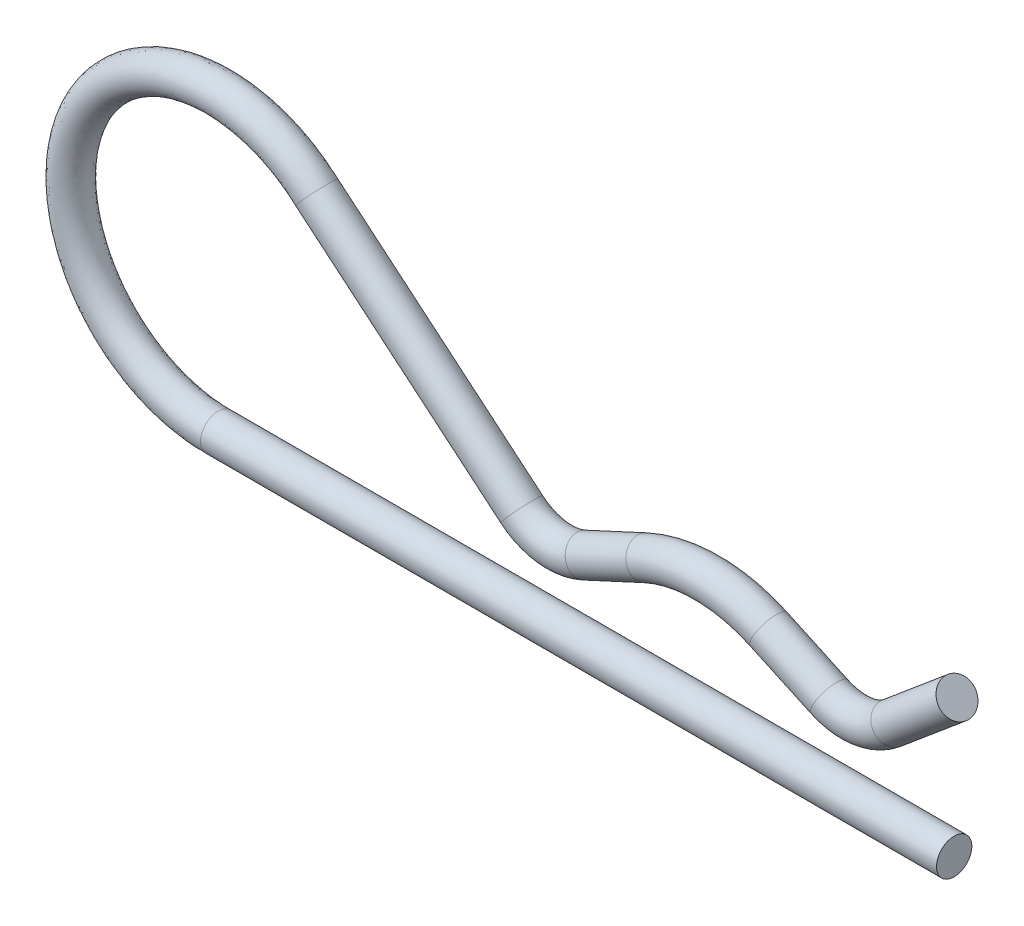
ISO-10303-21;
HEADER;
FILE_DESCRIPTION(('STEP AP214'),'2;1');
FILE_NAME('part.step','',(''),(''),'','','');
FILE_SCHEMA(('AUTOMOTIVE_DESIGN { 1 0 10303 214 1 1 1 1 }'));
ENDSEC;
DATA;
#1=APPLICATION_CONTEXT('core data for automotive mechanical design processes');
#2=APPLICATION_PROTOCOL_DEFINITION('international standard','automotive_design',2000,#1);
#3=PRODUCT_CONTEXT('',#1,'mechanical');
#4=PRODUCT('Part','Part','',(#3));
#5=PRODUCT_RELATED_PRODUCT_CATEGORY('part','',(#4));
#6=PRODUCT_DEFINITION_FORMATION('','',#4);
#7=PRODUCT_DEFINITION_CONTEXT('part definition',#1,'design');
#8=PRODUCT_DEFINITION('design','',#6,#7);
#9=PRODUCT_DEFINITION_SHAPE('','',#8);
#10=(LENGTH_UNIT() NAMED_UNIT(*) SI_UNIT(.MILLI.,.METRE.));
#11=(NAMED_UNIT(*) PLANE_ANGLE_UNIT() SI_UNIT($,.RADIAN.));
#12=(NAMED_UNIT(*) SI_UNIT($,.STERADIAN.) SOLID_ANGLE_UNIT());
#13=UNCERTAINTY_MEASURE_WITH_UNIT(LENGTH_MEASURE(1.E-05),#10,'distance_accuracy_value','');
#14=(GEOMETRIC_REPRESENTATION_CONTEXT(3) GLOBAL_UNCERTAINTY_ASSIGNED_CONTEXT((#13)) GLOBAL_UNIT_ASSIGNED_CONTEXT((#10,
#11,#12)) REPRESENTATION_CONTEXT('',''));
#15=CARTESIAN_POINT('',(0.,0.,0.));
#16=DIRECTION('',(0.,0.,1.));
#17=DIRECTION('',(1.,0.,0.));
#18=AXIS2_PLACEMENT_3D('',#15,#16,#17);
#19=CARTESIAN_POINT('',(0.244756199941598,11.9963702221383,0.));
#20=DIRECTION('',(-0.766044443118982,-0.642787609686535,0.));
#21=DIRECTION('',(0.642787609686535,-0.766044443118982,0.));
#22=AXIS2_PLACEMENT_3D('',#19,#20,#21);
#23=PLANE('',#22);
#24=CARTESIAN_POINT('',(0.244756199941598,11.9963702221383,0.));
#25=DIRECTION('',(-0.766044443118982,-0.642787609686535,0.));
#26=DIRECTION('',(0.642787609686535,-0.766044443118982,0.));
#27=AXIS2_PLACEMENT_3D('',#24,#25,#26);
#28=CIRCLE('',#27,1.524);
#29=CARTESIAN_POINT('',(1.22436451710388,10.828918490825,0.));
#30=VERTEX_POINT('',#29);
#31=EDGE_CURVE('E54',#30,#30,#28,.T.);
#32=ORIENTED_EDGE('',*,*,#31,.F.);
#33=EDGE_LOOP('',(#32));
#34=FACE_BOUND('',#33,.T.);
#35=ADVANCED_FACE('F51',(#34),#23,.F.);
#36=CARTESIAN_POINT('',(0.,0.,0.));
#37=DIRECTION('',(1.,0.,0.));
#38=DIRECTION('',(0.,1.,0.));
#39=AXIS2_PLACEMENT_3D('',#36,#37,#38);
#40=PLANE('',#39);
#41=CARTESIAN_POINT('',(0.,0.,0.));
#42=DIRECTION('',(1.,0.,0.));
#43=DIRECTION('',(0.,1.,0.));
#44=AXIS2_PLACEMENT_3D('',#41,#42,#43);
#45=CIRCLE('',#44,1.524);
#46=CARTESIAN_POINT('',(0.,0.,1.524));
#47=VERTEX_POINT('',#46);
#48=EDGE_CURVE('E77',#47,#47,#45,.T.);
#49=ORIENTED_EDGE('',*,*,#48,.T.);
#50=EDGE_LOOP('',(#49));
#51=FACE_BOUND('',#50,.T.);
#52=ADVANCED_FACE('F151',(#51),#40,.T.);
#53=CARTESIAN_POINT('',(-34.036,11.176,0.));
#54=DIRECTION('',(0.,0.,1.));
#55=DIRECTION('',(1.,0.,0.));
#56=AXIS2_PLACEMENT_3D('',#53,#54,#55);
#57=TOROIDAL_SURFACE('',#56,5.08000000000001,1.524);
#58=CARTESIAN_POINT('',(-37.3013610572076,7.28449422895555,0.));
#59=DIRECTION('',(-0.766044443118981,0.642787609686536,0.));
#60=DIRECTION('',(-0.642787609686536,-0.766044443118981,0.));
#61=AXIS2_PLACEMENT_3D('',#58,#59,#60);
#62=CIRCLE('',#61,1.524);
#63=CARTESIAN_POINT('',(-38.2809693743699,6.11704249764223,0.));
#64=VERTEX_POINT('',#63);
#65=EDGE_CURVE('E143',#64,#64,#62,.T.);
#66=CARTESIAN_POINT('',(-31.9036795697341,6.56518558357955,0.));
#67=DIRECTION('',(-0.907640633153629,-0.41974811619408,0.));
#68=DIRECTION('',(0.41974811619408,-0.907640633153629,0.));
#69=AXIS2_PLACEMENT_3D('',#66,#67,#68);
#70=CIRCLE('',#69,1.524);
#71=CARTESIAN_POINT('',(-31.2639834406543,5.18194125865343,0.));
#72=VERTEX_POINT('',#71);
#73=EDGE_CURVE('E140',#72,#72,#70,.T.);
#74=CARTESIAN_POINT('',(-34.036,11.176,0.));
#75=DIRECTION('',(0.,0.,1.));
#76=DIRECTION('',(1.,0.,0.));
#77=AXIS2_PLACEMENT_3D('',#74,#75,#76);
#78=CIRCLE('',#77,6.60400000000001);
#79=EDGE_CURVE('',#64,#72,#78,.T.);
#80=ORIENTED_EDGE('',*,*,#65,.F.);
#81=ORIENTED_EDGE('',*,*,#73,.T.);
#82=ORIENTED_EDGE('',*,*,#79,.T.);
#83=ORIENTED_EDGE('',*,*,#79,.F.);
#84=EDGE_LOOP('',(#80,#82,#81,#83));
#85=FACE_BOUND('',#84,.T.);
#86=ADVANCED_FACE('F148',(#85),#57,.T.);
#87=CARTESIAN_POINT('',(-31.9036795697341,6.56518558357956,0.));
#88=DIRECTION('',(0.907640633153629,0.419748116194081,0.));
#89=DIRECTION('',(-0.419748116194081,0.907640633153629,0.));
#90=AXIS2_PLACEMENT_3D('',#87,#88,#89);
#91=CYLINDRICAL_SURFACE('',#90,1.524);
#92=CARTESIAN_POINT('',(-26.6668010756648,8.98703604105108,0.));
#93=DIRECTION('',(-0.90764063315363,-0.41974811619408,0.));
#94=DIRECTION('',(0.41974811619408,-0.90764063315363,0.));
#95=AXIS2_PLACEMENT_3D('',#92,#93,#94);
#96=CIRCLE('',#95,1.524);
#97=CARTESIAN_POINT('',(-27.3064972047446,10.3702803659772,0.));
#98=VERTEX_POINT('',#97);
#99=EDGE_CURVE('E136',#98,#98,#96,.T.);
#100=ORIENTED_EDGE('',*,*,#99,.T.);
#101=EDGE_LOOP('',(#100));
#102=FACE_BOUND('',#101,.T.);
#103=ORIENTED_EDGE('',*,*,#73,.F.);
#104=EDGE_LOOP('',(#103));
#105=FACE_BOUND('',#104,.T.);
#106=ADVANCED_FACE('F150',(#102,#105),#91,.T.);
#107=CARTESIAN_POINT('',(-21.336,-2.54,0.));
#108=DIRECTION('',(0.,0.,-1.));
#109=DIRECTION('',(-1.,0.,0.));
#110=AXIS2_PLACEMENT_3D('',#107,#108,#109);
#111=TOROIDAL_SURFACE('',#110,12.7,1.524);
#112=CARTESIAN_POINT('',(-16.0051989243352,8.98703604105109,0.));
#113=DIRECTION('',(-0.907640633153629,0.419748116194081,0.));
#114=DIRECTION('',(-0.419748116194081,-0.907640633153629,0.));
#115=AXIS2_PLACEMENT_3D('',#112,#113,#114);
#116=CIRCLE('',#115,1.524);
#117=CARTESIAN_POINT('',(-15.3655027952554,10.3702803659772,0.));
#118=VERTEX_POINT('',#117);
#119=EDGE_CURVE('E130',#118,#118,#116,.T.);
#120=CARTESIAN_POINT('',(-21.336,-2.54,0.));
#121=DIRECTION('',(0.,0.,-1.));
#122=DIRECTION('',(-1.,0.,0.));
#123=AXIS2_PLACEMENT_3D('',#120,#121,#122);
#124=CIRCLE('',#123,14.224);
#125=EDGE_CURVE('',#98,#118,#124,.T.);
#126=ORIENTED_EDGE('',*,*,#99,.F.);
#127=ORIENTED_EDGE('',*,*,#119,.T.);
#128=ORIENTED_EDGE('',*,*,#125,.T.);
#129=ORIENTED_EDGE('',*,*,#125,.F.);
#130=EDGE_LOOP('',(#126,#128,#127,#129));
#131=FACE_BOUND('',#130,.T.);
#132=ADVANCED_FACE('F157',(#131),#111,.T.);
#133=CARTESIAN_POINT('',(-16.0051989243352,8.98703604105109,0.));
#134=DIRECTION('',(0.907640633153629,-0.419748116194081,0.));
#135=DIRECTION('',(0.419748116194081,0.907640633153629,0.));
#136=AXIS2_PLACEMENT_3D('',#133,#134,#135);
#137=CYLINDRICAL_SURFACE('',#136,1.524);
#138=CARTESIAN_POINT('',(-10.7683204302659,6.56518558357956,0.));
#139=DIRECTION('',(-0.907640633153629,0.419748116194082,0.));
#140=DIRECTION('',(-0.419748116194082,-0.907640633153628,0.));
#141=AXIS2_PLACEMENT_3D('',#138,#139,#140);
#142=CIRCLE('',#141,1.524);
#143=CARTESIAN_POINT('',(-11.4080165593457,5.18194125865343,0.));
#144=VERTEX_POINT('',#143);
#145=EDGE_CURVE('E125',#144,#144,#142,.T.);
#146=ORIENTED_EDGE('',*,*,#145,.T.);
#147=EDGE_LOOP('',(#146));
#148=FACE_BOUND('',#147,.T.);
#149=ORIENTED_EDGE('',*,*,#119,.F.);
#150=EDGE_LOOP('',(#149));
#151=FACE_BOUND('',#150,.T.);
#152=ADVANCED_FACE('F163',(#148,#151),#137,.T.);
#153=CARTESIAN_POINT('',(-8.636,11.176,0.));
#154=DIRECTION('',(0.,0.,1.));
#155=DIRECTION('',(1.,0.,0.));
#156=AXIS2_PLACEMENT_3D('',#153,#154,#155);
#157=TOROIDAL_SURFACE('',#156,5.08,1.524);
#158=CARTESIAN_POINT('',(-5.37063894279241,7.28449422895557,0.));
#159=DIRECTION('',(-0.766044443118982,-0.642787609686535,0.));
#160=DIRECTION('',(0.642787609686535,-0.766044443118982,0.));
#161=AXIS2_PLACEMENT_3D('',#158,#159,#160);
#162=CIRCLE('',#161,1.524);
#163=CARTESIAN_POINT('',(-4.39103062563013,6.11704249764224,0.));
#164=VERTEX_POINT('',#163);
#165=EDGE_CURVE('E120',#164,#164,#162,.T.);
#166=CARTESIAN_POINT('',(-8.636,11.176,0.));
#167=DIRECTION('',(0.,0.,1.));
#168=DIRECTION('',(1.,0.,0.));
#169=AXIS2_PLACEMENT_3D('',#166,#167,#168);
#170=CIRCLE('',#169,6.604);
#171=EDGE_CURVE('',#144,#164,#170,.T.);
#172=ORIENTED_EDGE('',*,*,#145,.F.);
#173=ORIENTED_EDGE('',*,*,#165,.T.);
#174=ORIENTED_EDGE('',*,*,#171,.T.);
#175=ORIENTED_EDGE('',*,*,#171,.F.);
#176=EDGE_LOOP('',(#172,#174,#173,#175));
#177=FACE_BOUND('',#176,.T.);
#178=ADVANCED_FACE('F167',(#177),#157,.T.);
#179=CARTESIAN_POINT('',(-5.3706389427924,7.28449422895557,0.));
#180=DIRECTION('',(0.766044443118981,0.642787609686535,0.));
#181=DIRECTION('',(-0.642787609686535,0.766044443118981,0.));
#182=AXIS2_PLACEMENT_3D('',#179,#180,#181);
#183=CYLINDRICAL_SURFACE('',#182,1.524);
#184=ORIENTED_EDGE('',*,*,#31,.T.);
#185=EDGE_LOOP('',(#184));
#186=FACE_BOUND('',#185,.T.);
#187=ORIENTED_EDGE('',*,*,#165,.F.);
#188=EDGE_LOOP('',(#187));
#189=FACE_BOUND('',#188,.T.);
#190=ADVANCED_FACE('F110',(#186,#189),#183,.T.);
#191=CARTESIAN_POINT('',(-55.1422877655178,22.2548092497594,0.));
#192=DIRECTION('',(0.766044443118982,-0.642787609686535,0.));
#193=DIRECTION('',(0.642787609686535,0.766044443118982,0.));
#194=AXIS2_PLACEMENT_3D('',#191,#192,#193);
#195=CYLINDRICAL_SURFACE('',#194,1.524);
#196=CARTESIAN_POINT('',(-54.9890788768939,22.126251727822,1.524));
#197=CARTESIAN_POINT('',(-54.9801066758844,22.1365589510736,1.52400135791989));
#198=CARTESIAN_POINT('',(-54.9711310069573,22.1468704706121,1.52381727310449));
#199=CARTESIAN_POINT('',(-54.9060165213673,22.2216782064566,1.52114113638119));
#200=CARTESIAN_POINT('',(-54.8498998238533,22.2861608263279,1.51160421517223));
#201=CARTESIAN_POINT('',(-54.7671622535244,22.3812507040928,1.48667206386632));
#202=CARTESIAN_POINT('',(-54.7397828618208,22.4127207260661,1.47656716114537));
#203=CARTESIAN_POINT('',(-54.6856559816457,22.4749401929308,1.45287133385924));
#204=CARTESIAN_POINT('',(-54.6589090134302,22.5056890444023,1.43927764127054));
#205=CARTESIAN_POINT('',(-54.5800480063157,22.5963575162002,1.39345725251045));
#206=CARTESIAN_POINT('',(-54.5291710082762,22.6548632425729,1.3561479397421));
#207=CARTESIAN_POINT('',(-54.4322630881302,22.7663204928542,1.26902396036675));
#208=CARTESIAN_POINT('',(-54.3862323659449,22.8192717876282,1.21920877814786));
#209=CARTESIAN_POINT('',(-54.3218207721162,22.893378262915,1.13623454552615));
#210=CARTESIAN_POINT('',(-54.301111548584,22.917206460494,1.10718117530255));
#211=CARTESIAN_POINT('',(-54.2613917494054,22.962911556997,1.0465504434253));
#212=CARTESIAN_POINT('',(-54.242379554408,22.9847903160923,1.01497554360857));
#213=CARTESIAN_POINT('',(-54.1880538600207,23.0473109321674,0.916719626571405));
#214=CARTESIAN_POINT('',(-54.1554385317743,23.084851762853,0.846490973833156));
#215=CARTESIAN_POINT('',(-54.0984324756162,23.1504727692172,0.698730006638271));
#216=CARTESIAN_POINT('',(-54.0740401294945,23.1785548063017,0.621199133040506));
#217=CARTESIAN_POINT('',(-54.0341354537481,23.2244983224524,0.460984346101386));
#218=CARTESIAN_POINT('',(-54.0186229650198,23.2423599846409,0.378300525116758));
#219=CARTESIAN_POINT('',(-53.9969247977797,23.2673446560744,0.21014646924132));
#220=CARTESIAN_POINT('',(-53.9907380552799,23.2744688903685,0.124676553357116));
#221=CARTESIAN_POINT('',(-53.9878606577442,23.2777822650402,-0.0466342648823853));
#222=CARTESIAN_POINT('',(-53.9911699991944,23.2739714094643,-0.132475167100389));
#223=CARTESIAN_POINT('',(-54.0071929477336,23.255521155061,-0.302087953718277));
#224=CARTESIAN_POINT('',(-54.0199059776226,23.2408824208504,-0.385859964780902));
#225=CARTESIAN_POINT('',(-54.0543694271579,23.2012018851159,-0.548952879109526));
#226=CARTESIAN_POINT('',(-54.0761199953776,23.1761599125669,-0.628273709175555));
#227=CARTESIAN_POINT('',(-54.1280703160226,23.1163550037338,-0.78025981364094));
#228=CARTESIAN_POINT('',(-54.1582707496947,23.0815912836612,-0.852924550784142));
#229=CARTESIAN_POINT('',(-54.2092016185188,23.0229729911656,-0.95527014522372));
#230=CARTESIAN_POINT('',(-54.227120029086,23.0023512255088,-0.988281173852118));
#231=CARTESIAN_POINT('',(-54.2647335863675,22.9590660278495,-1.05192130760944));
#232=CARTESIAN_POINT('',(-54.2844304306093,22.9364006452295,-1.08254808391416));
#233=CARTESIAN_POINT('',(-54.3459483156847,22.8656168457639,-1.17043906838046));
#234=CARTESIAN_POINT('',(-54.3902323339678,22.8146697716704,-1.22378537927934));
#235=CARTESIAN_POINT('',(-54.4840602482695,22.7067437386943,-1.31836944765525));
#236=CARTESIAN_POINT('',(-54.5336039502139,22.649765002371,-1.35960765169156));
#237=CARTESIAN_POINT('',(-54.6108013345647,22.5609993755583,-1.41153470847571));
#238=CARTESIAN_POINT('',(-54.6370488309509,22.5308213257715,-1.42720207477524));
#239=CARTESIAN_POINT('',(-54.6902933622954,22.4696091914617,-1.45509993762236));
#240=CARTESIAN_POINT('',(-54.7172897722271,22.4385758209027,-1.46733321068118));
#241=CARTESIAN_POINT('',(-54.7990618022417,22.3445848636587,-1.49870803288639));
#242=CARTESIAN_POINT('',(-54.8547708677289,22.2805632070994,-1.51262568497345));
#243=CARTESIAN_POINT('',(-54.9278675965938,22.1965753748175,-1.52137281356078));
#244=CARTESIAN_POINT('',(-54.9450051997986,22.1768854787314,-1.52274615981961));
#245=CARTESIAN_POINT('',(-54.9711272528565,22.1468747889248,-1.52381574317132));
#246=CARTESIAN_POINT('',(-54.9801021761067,22.1365641275512,-1.52399945294144));
#247=CARTESIAN_POINT('',(-54.9890788768942,22.126251727822,-1.524));
#248=B_SPLINE_CURVE_WITH_KNOTS('',3,(#196,#197,#198,#199,#200,#201,#202,#203,#204,#205,#206,
#207,#208,#209,#210,#211,#212,#213,#214,#215,#216,#217,#218,#219,#220,#221,#222,#223,#224,#225,
#226,#227,#228,#229,#230,#231,#232,#233,#234,#235,#236,#237,#238,#239,#240,#241,#242,#243,#244,
#245,#246,#247),.UNSPECIFIED.,.F.,.F.,(4,2,2,2,2,2,2,2,2,2,2,2,2,2,2,2,2,2,2,2,2,2,2,2,2,4),(0.,
0.0410098649983546,0.297527560516951,0.426170950834163,0.554916724709894,0.811751182087102,
1.06859623038352,1.19717419603609,1.32562812730973,1.58246073797993,1.8392427767277,
2.09602021447143,2.3527683538789,2.6095163982781,2.86624868475057,3.12298519196617,
3.37974240381272,3.50815922206319,3.63669993772451,3.89351557656355,4.15032174259091,
4.27904807219185,4.40767002305452,4.66417032887417,4.74256988403387,4.78357974903223),.UNSPECIFIED.);
#249=CARTESIAN_POINT('',(-54.9890788768942,22.126251727822,-1.524));
#250=VERTEX_POINT('',#249);
#251=CARTESIAN_POINT('',(-54.9890788768939,22.126251727822,1.524));
#252=VERTEX_POINT('',#251);
#253=EDGE_CURVE('E12',#250,#252,#248,.F.);
#254=ORIENTED_EDGE('',*,*,#253,.T.);
#255=CARTESIAN_POINT('',(-54.9890788768939,22.126251727822,1.524));
#256=CARTESIAN_POINT('',(-54.9980510751179,22.1159445020212,1.52400135790328));
#257=CARTESIAN_POINT('',(-55.007026896803,22.1056331155046,1.52381727309388));
#258=CARTESIAN_POINT('',(-55.0721444186692,22.0308263915876,1.52114110538491));
#259=CARTESIAN_POINT('',(-55.1282698847885,21.9663497753784,1.51160395652315));
#260=CARTESIAN_POINT('',(-55.2110291988445,21.8712764499502,1.48667128007833));
#261=CARTESIAN_POINT('',(-55.2384172912919,21.8398132171912,1.47656617032645));
#262=CARTESIAN_POINT('',(-55.2925642267645,21.7776096615493,1.45286988189008));
#263=CARTESIAN_POINT('',(-55.3193225516462,21.7468699339319,1.43927593517483));
#264=CARTESIAN_POINT('',(-55.3982211401233,21.6562319778298,1.39345474840943));
#265=CARTESIAN_POINT('',(-55.4491279400279,21.5977507877766,1.35614484715651));
#266=CARTESIAN_POINT('',(-55.5461018787624,21.4863482579871,1.2690196053039));
#267=CARTESIAN_POINT('',(-55.5921688179049,21.4334271476536,1.21920374900939));
#268=CARTESIAN_POINT('',(-55.6566366324553,21.3593674022022,1.13622824154248));
#269=CARTESIAN_POINT('',(-55.6773649820506,21.3355549669773,1.10717429767746));
#270=CARTESIAN_POINT('',(-55.7171230397946,21.2898814877099,1.04654235194917));
#271=CARTESIAN_POINT('',(-55.7361543672623,21.2680185834013,1.01496681197539));
#272=CARTESIAN_POINT('',(-55.7905366778776,21.2055450177546,0.916708870155098));
#273=CARTESIAN_POINT('',(-55.8231887226631,21.1680348757156,0.846478725193206));
#274=CARTESIAN_POINT('',(-55.8802614933464,21.1024706259001,0.698715198088176));
#275=CARTESIAN_POINT('',(-55.9046839151767,21.0744145698579,0.621183324879041));
#276=CARTESIAN_POINT('',(-55.9446388602614,21.028515031694,0.460966447502977));
#277=CARTESIAN_POINT('',(-55.9601715438549,21.0106713653773,0.378281536308269));
#278=CARTESIAN_POINT('',(-55.9818975222458,20.9857129564591,0.210126964148139));
#279=CARTESIAN_POINT('',(-55.9880920641106,20.9785967812487,0.124657676581559));
#280=CARTESIAN_POINT('',(-55.9909720554993,20.9752883001857,-0.0466517177388674));
#281=CARTESIAN_POINT('',(-55.9876575093314,20.9790959893838,-0.132491824324692));
#282=CARTESIAN_POINT('',(-55.9716118096151,20.9975289956967,-0.302101858122671));
#283=CARTESIAN_POINT('',(-55.9588813404437,21.0121535266113,-0.385871935333415));
#284=CARTESIAN_POINT('',(-55.9243728632487,21.0517962507007,-0.548960926504831));
#285=CARTESIAN_POINT('',(-55.9025947062672,21.0768146149959,-0.62827976715751));
#286=CARTESIAN_POINT('',(-55.8505821179876,21.1365657942888,-0.78026256650493));
#287=CARTESIAN_POINT('',(-55.8203469417726,21.1712994650367,-0.852925938219352));
#288=CARTESIAN_POINT('',(-55.7693618159764,21.2298703744546,-0.95526963647977));
#289=CARTESIAN_POINT('',(-55.7514249585089,21.2504759596417,-0.988280059936184));
#290=CARTESIAN_POINT('',(-55.7137743038032,21.2937284664149,-1.05191905541994));
#291=CARTESIAN_POINT('',(-55.69405880886,21.316377338313,-1.08254529869604));
#292=CARTESIAN_POINT('',(-55.632484205384,21.3871133689614,-1.17043670957448));
#293=CARTESIAN_POINT('',(-55.5881624180113,21.4380296448539,-1.22378379172801));
#294=CARTESIAN_POINT('',(-55.4942641988677,21.5458987641393,-1.31836914544633));
#295=CARTESIAN_POINT('',(-55.4446879606224,21.602851385209,-1.359607862761));
#296=CARTESIAN_POINT('',(-55.3674482669813,21.6915835634998,-1.4115354801654));
#297=CARTESIAN_POINT('',(-55.3411877348659,21.7217514119921,-1.42720299963255));
#298=CARTESIAN_POINT('',(-55.2879196318889,21.7829453325102,-1.45510108541067));
#299=CARTESIAN_POINT('',(-55.2609126840412,21.813970688797,-1.46733442832554));
#300=CARTESIAN_POINT('',(-55.1791132431097,21.9079412559744,-1.49870931264409));
#301=CARTESIAN_POINT('',(-55.1233914120662,21.9719541343907,-1.51262681785663));
#302=CARTESIAN_POINT('',(-55.0502882904448,22.0559346226111,-1.52137314010137));
#303=CARTESIAN_POINT('',(-55.0331515693201,22.0756212060744,-1.52274624355718));
#304=CARTESIAN_POINT('',(-55.0070306537787,22.1056287995399,-1.52381574315618));
#305=CARTESIAN_POINT('',(-54.9980555786044,22.1159393284777,-1.52399945289576));
#306=CARTESIAN_POINT('',(-54.9890788768942,22.126251727822,-1.524));
#307=B_SPLINE_CURVE_WITH_KNOTS('',3,(#255,#256,#257,#258,#259,#260,#261,#262,#263,#264,#265,
#266,#267,#268,#269,#270,#271,#272,#273,#274,#275,#276,#277,#278,#279,#280,#281,#282,#283,#284,
#285,#286,#287,#288,#289,#290,#291,#292,#293,#294,#295,#296,#297,#298,#299,#300,#301,#302,#303,
#304,#305,#306),.UNSPECIFIED.,.F.,.F.,(4,2,2,2,2,2,2,2,2,2,2,2,2,2,2,2,2,2,2,2,2,2,2,2,2,4),(0.,
0.0410098649899443,0.297531252436257,0.426176509763571,0.554924151018819,0.811762213203059,
1.06861086808643,1.19719144915698,1.32564799393367,1.58248581644817,1.83927067828841,
2.09605090850136,2.35279684381403,2.60954266280498,2.86626982258382,3.12300120919553,
3.37975521652092,3.50817044622575,3.63670957165808,3.89353026396243,4.1503415006423,
4.27907039908379,4.40769491575539,4.6642002861545,4.74259059208559,4.78360045707556),.UNSPECIFIED.);
#308=EDGE_CURVE('E60',#250,#252,#307,.F.);
#309=ORIENTED_EDGE('',*,*,#308,.F.);
#310=EDGE_LOOP('',(#254,#309));
#311=FACE_BOUND('',#310,.T.);
#312=ORIENTED_EDGE('',*,*,#65,.T.);
#313=EDGE_LOOP('',(#312));
#314=FACE_BOUND('',#313,.T.);
#315=ADVANCED_FACE('F70',(#311,#314),#195,.T.);
#316=CARTESIAN_POINT('',(0.,0.,0.));
#317=DIRECTION('',(-1.,0.,0.));
#318=DIRECTION('',(0.,0.,1.));
#319=AXIS2_PLACEMENT_3D('',#316,#317,#318);
#320=CYLINDRICAL_SURFACE('',#319,1.524);
#321=CARTESIAN_POINT('',(-63.5,0.,0.));
#322=DIRECTION('',(1.,0.,0.));
#323=DIRECTION('',(0.,1.,0.));
#324=AXIS2_PLACEMENT_3D('',#321,#322,#323);
#325=CIRCLE('',#324,1.524);
#326=CARTESIAN_POINT('',(-63.5,0.,1.524));
#327=VERTEX_POINT('',#326);
#328=EDGE_CURVE('E73',#327,#327,#325,.T.);
#329=CARTESIAN_POINT('',(-63.5,0.,1.524));
#330=CARTESIAN_POINT('',(-62.8385416666667,0.,1.524));
#331=CARTESIAN_POINT('',(-62.1770833333333,0.,1.524));
#332=CARTESIAN_POINT('',(-60.8541666666667,0.,1.524));
#333=CARTESIAN_POINT('',(-60.1927083333333,0.,1.524));
#334=CARTESIAN_POINT('',(-58.8697916666667,0.,1.524));
#335=CARTESIAN_POINT('',(-58.2083333333333,0.,1.524));
#336=CARTESIAN_POINT('',(-56.8854166666667,0.,1.524));
#337=CARTESIAN_POINT('',(-56.2239583333333,0.,1.524));
#338=CARTESIAN_POINT('',(-54.9010416666667,0.,1.524));
#339=CARTESIAN_POINT('',(-54.2395833333333,0.,1.524));
#340=CARTESIAN_POINT('',(-52.9166666666667,0.,1.524));
#341=CARTESIAN_POINT('',(-52.2552083333333,0.,1.524));
#342=CARTESIAN_POINT('',(-50.9322916666667,0.,1.524));
#343=CARTESIAN_POINT('',(-50.2708333333333,0.,1.524));
#344=CARTESIAN_POINT('',(-48.9479166666667,0.,1.524));
#345=CARTESIAN_POINT('',(-48.2864583333333,0.,1.524));
#346=CARTESIAN_POINT('',(-46.9635416666667,0.,1.524));
#347=CARTESIAN_POINT('',(-46.3020833333333,0.,1.524));
#348=CARTESIAN_POINT('',(-44.9791666666667,0.,1.524));
#349=CARTESIAN_POINT('',(-44.3177083333333,0.,1.524));
#350=CARTESIAN_POINT('',(-42.9947916666667,0.,1.524));
#351=CARTESIAN_POINT('',(-42.3333333333333,0.,1.524));
#352=CARTESIAN_POINT('',(-41.0104166666667,0.,1.524));
#353=CARTESIAN_POINT('',(-40.3489583333333,0.,1.524));
#354=CARTESIAN_POINT('',(-39.0260416666667,0.,1.524));
#355=CARTESIAN_POINT('',(-38.3645833333333,0.,1.524));
#356=CARTESIAN_POINT('',(-37.0416666666667,0.,1.524));
#357=CARTESIAN_POINT('',(-36.3802083333333,0.,1.524));
#358=CARTESIAN_POINT('',(-35.0572916666667,0.,1.524));
#359=CARTESIAN_POINT('',(-34.3958333333333,0.,1.524));
#360=CARTESIAN_POINT('',(-33.0729166666667,0.,1.524));
#361=CARTESIAN_POINT('',(-32.4114583333333,0.,1.524));
#362=CARTESIAN_POINT('',(-31.0885416666667,0.,1.524));
#363=CARTESIAN_POINT('',(-30.4270833333333,0.,1.524));
#364=CARTESIAN_POINT('',(-29.1041666666667,0.,1.524));
#365=CARTESIAN_POINT('',(-28.4427083333333,0.,1.524));
#366=CARTESIAN_POINT('',(-27.1197916666667,0.,1.524));
#367=CARTESIAN_POINT('',(-26.4583333333333,0.,1.524));
#368=CARTESIAN_POINT('',(-25.1354166666667,0.,1.524));
#369=CARTESIAN_POINT('',(-24.4739583333333,0.,1.524));
#370=CARTESIAN_POINT('',(-23.1510416666667,0.,1.524));
#371=CARTESIAN_POINT('',(-22.4895833333333,0.,1.524));
#372=CARTESIAN_POINT('',(-21.1666666666667,0.,1.524));
#373=CARTESIAN_POINT('',(-20.5052083333333,0.,1.524));
#374=CARTESIAN_POINT('',(-19.1822916666667,0.,1.524));
#375=CARTESIAN_POINT('',(-18.5208333333333,0.,1.524));
#376=CARTESIAN_POINT('',(-17.1979166666667,0.,1.524));
#377=CARTESIAN_POINT('',(-16.5364583333333,0.,1.524));
#378=CARTESIAN_POINT('',(-15.2135416666667,0.,1.524));
#379=CARTESIAN_POINT('',(-14.5520833333334,0.,1.524));
#380=CARTESIAN_POINT('',(-13.2291666666667,0.,1.524));
#381=CARTESIAN_POINT('',(-12.5677083333334,0.,1.524));
#382=CARTESIAN_POINT('',(-11.2447916666667,0.,1.524));
#383=CARTESIAN_POINT('',(-10.5833333333333,0.,1.524));
#384=CARTESIAN_POINT('',(-9.26041666666668,0.,1.524));
#385=CARTESIAN_POINT('',(-8.59895833333335,0.,1.524));
#386=CARTESIAN_POINT('',(-7.27604166666668,0.,1.524));
#387=CARTESIAN_POINT('',(-6.61458333333335,0.,1.524));
#388=CARTESIAN_POINT('',(-5.29166666666668,0.,1.524));
#389=CARTESIAN_POINT('',(-4.63020833333335,0.,1.524));
#390=CARTESIAN_POINT('',(-3.30729166666668,0.,1.524));
#391=CARTESIAN_POINT('',(-2.64583333333335,0.,1.524));
#392=CARTESIAN_POINT('',(-1.32291666666668,0.,1.524));
#393=CARTESIAN_POINT('',(-0.661458333333348,0.,1.524));
#394=CARTESIAN_POINT('',(0.,0.,1.524));
#395=B_SPLINE_CURVE_WITH_KNOTS('',3,(#329,#330,#331,#332,#333,#334,#335,#336,#337,#338,#339,
#340,#341,#342,#343,#344,#345,#346,#347,#348,#349,#350,#351,#352,#353,#354,#355,#356,#357,#358,
#359,#360,#361,#362,#363,#364,#365,#366,#367,#368,#369,#370,#371,#372,#373,#374,#375,#376,#377,
#378,#379,#380,#381,#382,#383,#384,#385,#386,#387,#388,#389,#390,#391,#392,#393,#394),
.UNSPECIFIED.,.F.,.F.,(4,2,2,2,2,2,2,2,2,2,2,2,2,2,2,2,2,2,2,2,2,2,2,2,2,2,2,2,2,2,2,2,4),(0.,
1.984375,3.96875,5.953125,7.9375,9.921875,11.90625,13.890625,15.875,17.859375,19.84375,
21.828125,23.8125,25.796875,27.78125,29.765625,31.75,33.734375,35.71875,37.703125,39.6875,
41.671875,43.65625,45.640625,47.625,49.609375,51.59375,53.578125,55.5625,57.546875,59.53125,
61.515625,63.5),.UNSPECIFIED.);
#396=EDGE_CURVE('BSEAM98',#327,#47,#395,.T.);
#397=ORIENTED_EDGE('',*,*,#328,.T.);
#398=ORIENTED_EDGE('',*,*,#48,.F.);
#399=ORIENTED_EDGE('',*,*,#396,.T.);
#400=ORIENTED_EDGE('',*,*,#396,.F.);
#401=EDGE_LOOP('',(#397,#399,#398,#400));
#402=FACE_BOUND('',#401,.T.);
#403=ADVANCED_FACE('F98',(#402),#320,.T.);
#404=CARTESIAN_POINT('',(-63.5,1.52399999999999,0.));
#405=CARTESIAN_POINT('',(-63.7409987000568,1.52399999999999,0.));
#406=CARTESIAN_POINT('',(-63.9512077022419,1.53083347378136,0.));
#407=CARTESIAN_POINT('',(-64.4015714029009,1.55814026805,0.));
#408=CARTESIAN_POINT('',(-64.6263427535573,1.57861392224216,0.));
#409=CARTESIAN_POINT('',(-65.2982172185868,1.66038986237284,0.));
#410=CARTESIAN_POINT('',(-65.7428806136151,1.74207505596106,0.));
#411=CARTESIAN_POINT('',(-67.0571986258838,2.06684712606995,0.));
#412=CARTESIAN_POINT('',(-67.9068103977226,2.38993512459631,0.));
#413=CARTESIAN_POINT('',(-70.3025998245572,3.65094645319342,0.));
#414=CARTESIAN_POINT('',(-71.6907982871065,4.88517064255219,0.));
#415=CARTESIAN_POINT('',(-73.734418924014,7.86084679372372,0.));
#416=CARTESIAN_POINT('',(-74.3879860142956,9.59959760378212,0.));
#417=CARTESIAN_POINT('',(-74.81043113471,13.1846462763293,0.));
#418=CARTESIAN_POINT('',(-74.5789256928542,15.02768983289,0.));
#419=CARTESIAN_POINT('',(-73.2829548835906,18.3968875898876,0.));
#420=CARTESIAN_POINT('',(-72.2196659257042,19.9199834217347,0.));
#421=CARTESIAN_POINT('',(-69.5035918689475,22.2977924095763,0.));
#422=CARTESIAN_POINT('',(-67.8532722696614,23.1503471240106,0.));
#423=CARTESIAN_POINT('',(-64.3422937207955,23.9894320385938,0.));
#424=CARTESIAN_POINT('',(-62.4848217882162,23.9752005511863,0.));
#425=CARTESIAN_POINT('',(-59.8615398054346,23.3056128055117,0.));
#426=CARTESIAN_POINT('',(-59.0145854163755,22.9761122927272,0.));
#427=CARTESIAN_POINT('',(-57.8215318991779,22.3364718122253,0.));
#428=CARTESIAN_POINT('',(-57.4367638747341,22.0991369274687,0.));
#429=CARTESIAN_POINT('',(-56.8832279873662,21.7095622510665,0.));
#430=CARTESIAN_POINT('',(-56.7026475894878,21.5741136166189,0.));
#431=CARTESIAN_POINT('',(-56.3499918613143,21.292512780905,0.));
#432=CARTESIAN_POINT('',(-56.1893418972694,21.156670944509,0.));
#433=CARTESIAN_POINT('',(-55.963875905726,20.9531062369927,0.));
#434=CARTESIAN_POINT('',(-55.9114261389323,20.9057480178785,0.));
#435=CARTESIAN_POINT('',(-55.8619445025672,20.8610712665762,0.));
#436=CARTESIAN_POINT('',(-63.5,1.52399999999999,3.048));
#437=CARTESIAN_POINT('',(-63.7409987000568,1.52399999999999,3.048));
#438=CARTESIAN_POINT('',(-63.9512077022419,1.53083347378136,3.048));
#439=CARTESIAN_POINT('',(-64.4015714029009,1.55814026805,3.048));
#440=CARTESIAN_POINT('',(-64.6263427535573,1.57861392224216,3.048));
#441=CARTESIAN_POINT('',(-65.2982172185868,1.66038986237284,3.048));
#442=CARTESIAN_POINT('',(-65.7428806136151,1.74207505596106,3.048));
#443=CARTESIAN_POINT('',(-67.0571986258838,2.06684712606995,3.048));
#444=CARTESIAN_POINT('',(-67.9068103977226,2.38993512459631,3.048));
#445=CARTESIAN_POINT('',(-70.3025998245572,3.65094645319342,3.048));
#446=CARTESIAN_POINT('',(-71.6907982871065,4.88517064255219,3.048));
#447=CARTESIAN_POINT('',(-73.734418924014,7.86084679372372,3.048));
#448=CARTESIAN_POINT('',(-74.3879860142956,9.59959760378212,3.048));
#449=CARTESIAN_POINT('',(-74.81043113471,13.1846462763293,3.048));
#450=CARTESIAN_POINT('',(-74.5789256928542,15.02768983289,3.048));
#451=CARTESIAN_POINT('',(-73.2829548835906,18.3968875898876,3.048));
#452=CARTESIAN_POINT('',(-72.2196659257042,19.9199834217347,3.048));
#453=CARTESIAN_POINT('',(-69.5035918689475,22.2977924095763,3.048));
#454=CARTESIAN_POINT('',(-67.8532722696614,23.1503471240106,3.048));
#455=CARTESIAN_POINT('',(-64.3422937207955,23.9894320385938,3.048));
#456=CARTESIAN_POINT('',(-62.4848217882162,23.9752005511863,3.048));
#457=CARTESIAN_POINT('',(-59.8615398054346,23.3056128055117,3.048));
#458=CARTESIAN_POINT('',(-59.0145854163755,22.9761122927272,3.048));
#459=CARTESIAN_POINT('',(-57.8215318991779,22.3364718122253,3.048));
#460=CARTESIAN_POINT('',(-57.4367638747341,22.0991369274687,3.048));
#461=CARTESIAN_POINT('',(-56.8832279873662,21.7095622510665,3.048));
#462=CARTESIAN_POINT('',(-56.7026475894878,21.5741136166189,3.048));
#463=CARTESIAN_POINT('',(-56.3499918613143,21.292512780905,3.048));
#464=CARTESIAN_POINT('',(-56.1893418972694,21.156670944509,3.048));
#465=CARTESIAN_POINT('',(-55.963875905726,20.9531062369927,3.048));
#466=CARTESIAN_POINT('',(-55.9114261389323,20.9057480178785,3.048));
#467=CARTESIAN_POINT('',(-55.8619445025672,20.8610712665762,3.048));
#468=CARTESIAN_POINT('',(-63.5,-1.52400000000001,3.048));
#469=CARTESIAN_POINT('',(-63.7717644915534,-1.52400000000001,3.048));
#470=CARTESIAN_POINT('',(-64.0742643483079,-1.51530285155103,3.048));
#471=CARTESIAN_POINT('',(-64.6474545127829,-1.48054874975451,3.048));
#472=CARTESIAN_POINT('',(-64.9335271408919,-1.45449137169176,3.048));
#473=CARTESIAN_POINT('',(-65.7886400963816,-1.35041290243464,3.048));
#474=CARTESIAN_POINT('',(-66.354575326416,-1.24644992877717,3.048));
#475=CARTESIAN_POINT('',(-68.0273437056767,-0.833103657728468,3.048));
#476=CARTESIAN_POINT('',(-69.108667778919,-0.421900750513982,3.048));
#477=CARTESIAN_POINT('',(-72.157854322165,1.18302275861021,3.048));
#478=CARTESIAN_POINT('',(-73.9246523654043,2.75385354506764,3.048));
#479=CARTESIAN_POINT('',(-76.5256240851126,6.54107773746534,3.048));
#480=CARTESIAN_POINT('',(-77.3574367454808,8.7540333139038,3.048));
#481=CARTESIAN_POINT('',(-77.8950941714355,13.3168225335108,3.048));
#482=CARTESIAN_POINT('',(-77.6004508818235,15.6625143327691,3.048));
#483=CARTESIAN_POINT('',(-75.9510334881972,19.9505842053116,3.048));
#484=CARTESIAN_POINT('',(-74.5977566327093,21.8890698094811,3.048));
#485=CARTESIAN_POINT('',(-71.1409351059384,24.9153721576419,3.048));
#486=CARTESIAN_POINT('',(-69.0405283432028,26.0004417941953,3.048));
#487=CARTESIAN_POINT('',(-64.572010190106,27.0683680491193,3.048));
#488=CARTESIAN_POINT('',(-62.2079550031817,27.0502552469646,3.048));
#489=CARTESIAN_POINT('',(-58.8692324796454,26.1980526615603,3.048));
#490=CARTESIAN_POINT('',(-57.791290529936,25.7786883725602,3.048));
#491=CARTESIAN_POINT('',(-56.2728587807702,24.9646004882875,3.048));
#492=CARTESIAN_POINT('',(-55.7831540223882,24.6625379076871,3.048));
#493=CARTESIAN_POINT('',(-55.0786538021028,24.1667155922666,3.048));
#494=CARTESIAN_POINT('',(-54.8488242048021,23.9943264211512,3.048));
#495=CARTESIAN_POINT('',(-54.3999896416733,23.6359253575155,3.048));
#496=CARTESIAN_POINT('',(-54.1695662543894,23.4395967615938,3.048));
#497=CARTESIAN_POINT('',(-53.9153168304282,23.2100456768046,3.048));
#498=CARTESIAN_POINT('',(-53.8688050693869,23.1680484325557,3.048));
#499=CARTESIAN_POINT('',(-53.8193234330217,23.1233716812535,3.048));
#500=CARTESIAN_POINT('',(-63.5,-1.52400000000001,0.));
#501=CARTESIAN_POINT('',(-63.7717644915534,-1.52400000000001,0.));
#502=CARTESIAN_POINT('',(-64.0742643483079,-1.51530285155103,0.));
#503=CARTESIAN_POINT('',(-64.6474545127829,-1.48054874975451,0.));
#504=CARTESIAN_POINT('',(-64.9335271408919,-1.45449137169176,0.));
#505=CARTESIAN_POINT('',(-65.7886400963816,-1.35041290243464,0.));
#506=CARTESIAN_POINT('',(-66.354575326416,-1.24644992877717,0.));
#507=CARTESIAN_POINT('',(-68.0273437056767,-0.833103657728468,0.));
#508=CARTESIAN_POINT('',(-69.108667778919,-0.421900750513982,0.));
#509=CARTESIAN_POINT('',(-72.157854322165,1.18302275861021,0.));
#510=CARTESIAN_POINT('',(-73.9246523654043,2.75385354506764,0.));
#511=CARTESIAN_POINT('',(-76.5256240851126,6.54107773746534,0.));
#512=CARTESIAN_POINT('',(-77.3574367454736,8.75403331390291,0.));
#513=CARTESIAN_POINT('',(-77.8950941714426,13.3168225335117,0.));
#514=CARTESIAN_POINT('',(-77.6004508818235,15.6625143327691,0.));
#515=CARTESIAN_POINT('',(-75.9510334881972,19.9505842053116,0.));
#516=CARTESIAN_POINT('',(-74.5977566327093,21.8890698094811,0.));
#517=CARTESIAN_POINT('',(-71.1409351059384,24.9153721576419,0.));
#518=CARTESIAN_POINT('',(-69.0405283432028,26.0004417941953,0.));
#519=CARTESIAN_POINT('',(-64.572010190106,27.0683680491193,0.));
#520=CARTESIAN_POINT('',(-62.2079550031817,27.0502552469628,0.));
#521=CARTESIAN_POINT('',(-58.8692324796454,26.1980526615612,0.));
#522=CARTESIAN_POINT('',(-57.791290529936,25.7786883725602,0.));
#523=CARTESIAN_POINT('',(-56.2728587807702,24.9646004882875,0.));
#524=CARTESIAN_POINT('',(-55.7831540223882,24.6625379076871,0.));
#525=CARTESIAN_POINT('',(-55.0786538021028,24.1667155922666,0.));
#526=CARTESIAN_POINT('',(-54.8488242048021,23.9943264211514,0.));
#527=CARTESIAN_POINT('',(-54.3999896416733,23.6359253575153,0.));
#528=CARTESIAN_POINT('',(-54.1695662543894,23.4395967615938,0.));
#529=CARTESIAN_POINT('',(-53.9153168304282,23.2100456768046,0.));
#530=CARTESIAN_POINT('',(-53.8688050693869,23.1680484325557,0.));
#531=CARTESIAN_POINT('',(-53.8193234330217,23.1233716812535,0.));
#532=CARTESIAN_POINT('',(-63.5,-1.52400000000001,-3.048));
#533=CARTESIAN_POINT('',(-63.7717644915534,-1.52400000000001,-3.048));
#534=CARTESIAN_POINT('',(-64.0742643483079,-1.51530285155103,-3.048));
#535=CARTESIAN_POINT('',(-64.6474545127829,-1.48054874975451,-3.048));
#536=CARTESIAN_POINT('',(-64.9335271408919,-1.45449137169176,-3.048));
#537=CARTESIAN_POINT('',(-65.7886400963816,-1.35041290243464,-3.048));
#538=CARTESIAN_POINT('',(-66.354575326416,-1.24644992877717,-3.048));
#539=CARTESIAN_POINT('',(-68.0273437056767,-0.833103657728468,-3.048));
#540=CARTESIAN_POINT('',(-69.108667778919,-0.421900750513983,-3.048));
#541=CARTESIAN_POINT('',(-72.157854322165,1.18302275861021,-3.048));
#542=CARTESIAN_POINT('',(-73.9246523654043,2.75385354506764,-3.048));
#543=CARTESIAN_POINT('',(-76.5256240851126,6.54107773746534,-3.048));
#544=CARTESIAN_POINT('',(-77.3574367454665,8.75403331390202,-3.048));
#545=CARTESIAN_POINT('',(-77.8950941714497,13.3168225335125,-3.048));
#546=CARTESIAN_POINT('',(-77.6004508818235,15.6625143327691,-3.048));
#547=CARTESIAN_POINT('',(-75.9510334881972,19.9505842053116,-3.048));
#548=CARTESIAN_POINT('',(-74.5977566327093,21.8890698094811,-3.048));
#549=CARTESIAN_POINT('',(-71.1409351059384,24.9153721576419,-3.048));
#550=CARTESIAN_POINT('',(-69.0405283432028,26.0004417941953,-3.048));
#551=CARTESIAN_POINT('',(-64.572010190106,27.0683680491193,-3.048));
#552=CARTESIAN_POINT('',(-62.2079550031817,27.050255246961,-3.048));
#553=CARTESIAN_POINT('',(-58.8692324796454,26.1980526615621,-3.048));
#554=CARTESIAN_POINT('',(-57.791290529936,25.7786883725602,-3.048));
#555=CARTESIAN_POINT('',(-56.2728587807702,24.9646004882875,-3.048));
#556=CARTESIAN_POINT('',(-55.7831540223882,24.6625379076871,-3.048));
#557=CARTESIAN_POINT('',(-55.0786538021028,24.1667155922666,-3.048));
#558=CARTESIAN_POINT('',(-54.8488242048021,23.9943264211517,-3.048));
#559=CARTESIAN_POINT('',(-54.3999896416733,23.6359253575151,-3.048));
#560=CARTESIAN_POINT('',(-54.1695662543894,23.4395967615938,-3.048));
#561=CARTESIAN_POINT('',(-53.9153168304282,23.2100456768046,-3.048));
#562=CARTESIAN_POINT('',(-53.8688050693869,23.1680484325557,-3.048));
#563=CARTESIAN_POINT('',(-53.8193234330217,23.1233716812535,-3.048));
#564=CARTESIAN_POINT('',(-63.5,1.52399999999999,-3.048));
#565=CARTESIAN_POINT('',(-63.7409987000568,1.52399999999999,-3.048));
#566=CARTESIAN_POINT('',(-63.9512077022419,1.53083347378136,-3.048));
#567=CARTESIAN_POINT('',(-64.4015714029009,1.55814026805,-3.048));
#568=CARTESIAN_POINT('',(-64.6263427535573,1.57861392224216,-3.048));
#569=CARTESIAN_POINT('',(-65.2982172185868,1.66038986237284,-3.048));
#570=CARTESIAN_POINT('',(-65.7428806136151,1.74207505596106,-3.048));
#571=CARTESIAN_POINT('',(-67.0571986258838,2.06684712606995,-3.048));
#572=CARTESIAN_POINT('',(-67.9068103977226,2.38993512459631,-3.048));
#573=CARTESIAN_POINT('',(-70.3025998245572,3.65094645319342,-3.048));
#574=CARTESIAN_POINT('',(-71.6907982871065,4.88517064255219,-3.048));
#575=CARTESIAN_POINT('',(-73.734418924014,7.86084679372372,-3.048));
#576=CARTESIAN_POINT('',(-74.3879860142956,9.59959760378212,-3.048));
#577=CARTESIAN_POINT('',(-74.81043113471,13.1846462763293,-3.048));
#578=CARTESIAN_POINT('',(-74.5789256928542,15.02768983289,-3.048));
#579=CARTESIAN_POINT('',(-73.2829548835906,18.3968875898876,-3.048));
#580=CARTESIAN_POINT('',(-72.2196659257042,19.9199834217347,-3.048));
#581=CARTESIAN_POINT('',(-69.5035918689475,22.2977924095763,-3.048));
#582=CARTESIAN_POINT('',(-67.8532722696614,23.1503471240106,-3.048));
#583=CARTESIAN_POINT('',(-64.3422937207955,23.9894320385938,-3.048));
#584=CARTESIAN_POINT('',(-62.4848217882162,23.9752005511863,-3.048));
#585=CARTESIAN_POINT('',(-59.8615398054346,23.3056128055117,-3.048));
#586=CARTESIAN_POINT('',(-59.0145854163755,22.9761122927272,-3.048));
#587=CARTESIAN_POINT('',(-57.8215318991779,22.3364718122253,-3.048));
#588=CARTESIAN_POINT('',(-57.4367638747341,22.0991369274687,-3.048));
#589=CARTESIAN_POINT('',(-56.8832279873662,21.7095622510665,-3.048));
#590=CARTESIAN_POINT('',(-56.7026475894878,21.5741136166189,-3.048));
#591=CARTESIAN_POINT('',(-56.3499918613143,21.292512780905,-3.048));
#592=CARTESIAN_POINT('',(-56.1893418972694,21.156670944509,-3.048));
#593=CARTESIAN_POINT('',(-55.963875905726,20.9531062369927,-3.048));
#594=CARTESIAN_POINT('',(-55.9114261389323,20.9057480178785,-3.048));
#595=CARTESIAN_POINT('',(-55.8619445025672,20.8610712665762,-3.048));
#596=CARTESIAN_POINT('',(-63.5,1.52399999999999,0.));
#597=CARTESIAN_POINT('',(-63.7409987000568,1.52399999999999,0.));
#598=CARTESIAN_POINT('',(-63.9512077022419,1.53083347378136,0.));
#599=CARTESIAN_POINT('',(-64.4015714029009,1.55814026805,0.));
#600=CARTESIAN_POINT('',(-64.6263427535573,1.57861392224216,0.));
#601=CARTESIAN_POINT('',(-65.2982172185868,1.66038986237284,0.));
#602=CARTESIAN_POINT('',(-65.7428806136151,1.74207505596106,0.));
#603=CARTESIAN_POINT('',(-67.0571986258838,2.06684712606995,0.));
#604=CARTESIAN_POINT('',(-67.9068103977226,2.38993512459631,0.));
#605=CARTESIAN_POINT('',(-70.3025998245572,3.65094645319342,0.));
#606=CARTESIAN_POINT('',(-71.6907982871065,4.88517064255219,0.));
#607=CARTESIAN_POINT('',(-73.734418924014,7.86084679372372,0.));
#608=CARTESIAN_POINT('',(-74.3879860142956,9.59959760378212,0.));
#609=CARTESIAN_POINT('',(-74.81043113471,13.1846462763293,0.));
#610=CARTESIAN_POINT('',(-74.5789256928542,15.02768983289,0.));
#611=CARTESIAN_POINT('',(-73.2829548835906,18.3968875898876,0.));
#612=CARTESIAN_POINT('',(-72.2196659257042,19.9199834217347,0.));
#613=CARTESIAN_POINT('',(-69.5035918689475,22.2977924095763,0.));
#614=CARTESIAN_POINT('',(-67.8532722696614,23.1503471240106,0.));
#615=CARTESIAN_POINT('',(-64.3422937207955,23.9894320385938,0.));
#616=CARTESIAN_POINT('',(-62.4848217882162,23.9752005511863,0.));
#617=CARTESIAN_POINT('',(-59.8615398054346,23.3056128055117,0.));
#618=CARTESIAN_POINT('',(-59.0145854163755,22.9761122927272,0.));
#619=CARTESIAN_POINT('',(-57.8215318991779,22.3364718122253,0.));
#620=CARTESIAN_POINT('',(-57.4367638747341,22.0991369274687,0.));
#621=CARTESIAN_POINT('',(-56.8832279873662,21.7095622510665,0.));
#622=CARTESIAN_POINT('',(-56.7026475894878,21.5741136166189,0.));
#623=CARTESIAN_POINT('',(-56.3499918613143,21.292512780905,0.));
#624=CARTESIAN_POINT('',(-56.1893418972694,21.156670944509,0.));
#625=CARTESIAN_POINT('',(-55.963875905726,20.9531062369927,0.));
#626=CARTESIAN_POINT('',(-55.9114261389323,20.9057480178785,0.));
#627=CARTESIAN_POINT('',(-55.8619445025672,20.8610712665762,0.));
#628=(BOUNDED_SURFACE() B_SPLINE_SURFACE(3,3,((#404,#405,#406,#407,#408,#409,#410,#411,#412,
#413,#414,#415,#416,#417,#418,#419,#420,#421,#422,#423,#424,#425,#426,#427,#428,#429,#430,#431,
#432,#433,#434,#435),(#436,#437,#438,#439,#440,#441,#442,#443,#444,#445,#446,#447,#448,#449,
#450,#451,#452,#453,#454,#455,#456,#457,#458,#459,#460,#461,#462,#463,#464,#465,#466,#467),
(#468,#469,#470,#471,#472,#473,#474,#475,#476,#477,#478,#479,#480,#481,#482,#483,#484,#485,#486,
#487,#488,#489,#490,#491,#492,#493,#494,#495,#496,#497,#498,#499),(#500,#501,#502,#503,#504,
#505,#506,#507,#508,#509,#510,#511,#512,#513,#514,#515,#516,#517,#518,#519,#520,#521,#522,#523,
#524,#525,#526,#527,#528,#529,#530,#531),(#532,#533,#534,#535,#536,#537,#538,#539,#540,#541,
#542,#543,#544,#545,#546,#547,#548,#549,#550,#551,#552,#553,#554,#555,#556,#557,#558,#559,#560,
#561,#562,#563),(#564,#565,#566,#567,#568,#569,#570,#571,#572,#573,#574,#575,#576,#577,#578,
#579,#580,#581,#582,#583,#584,#585,#586,#587,#588,#589,#590,#591,#592,#593,#594,#595),(#596,
#597,#598,#599,#600,#601,#602,#603,#604,#605,#606,#607,#608,#609,#610,#611,#612,#613,#614,#615,
#616,#617,#618,#619,#620,#621,#622,#623,#624,#625,#626,#627)),.UNSPECIFIED.,.T.,.F.,
.F.) B_SPLINE_SURFACE_WITH_KNOTS((4,3,4),(4,2,2,2,2,2,2,2,2,2,2,2,2,2,2,4),(0.,0.5,1.),
(0.56331647758302,0.570139657620785,0.576962837658551,0.590609197734081,0.617901917885143,
0.672487358187265,0.727072798489388,0.78165823879151,0.836243679093633,0.890829119395755,
0.945414559697878,0.972707279848939,0.986353639924469,0.993176819962235,1.,1.00177348766156),
.UNSPECIFIED.) GEOMETRIC_REPRESENTATION_ITEM() RATIONAL_B_SPLINE_SURFACE(((1.,1.,1.,1.,1.,1.,1.,
1.,1.,1.,1.,1.,1.,1.,1.,1.,1.,1.,1.,1.,1.,1.,1.,1.,1.,1.,1.,1.,1.,1.,1.,1.),(0.333333333333333,
0.333333333333333,0.333333333333333,0.333333333333333,0.333333333333333,0.333333333333333,
0.333333333333333,0.333333333333333,0.333333333333333,0.333333333333333,0.333333333333333,
0.333333333333333,0.333333333333333,0.333333333333333,0.333333333333333,0.333333333333333,
0.333333333333333,0.333333333333333,0.333333333333333,0.333333333333333,0.333333333333333,
0.333333333333333,0.333333333333333,0.333333333333333,0.333333333333333,0.333333333333333,
0.333333333333333,0.333333333333333,0.333333333333333,0.333333333333333,0.333333333333333,
0.333333333333333),(0.333333333333333,0.333333333333333,0.333333333333333,0.333333333333333,
0.333333333333333,0.333333333333333,0.333333333333333,0.333333333333333,0.333333333333333,
0.333333333333333,0.333333333333333,0.333333333333333,0.333333333333333,0.333333333333333,
0.333333333333333,0.333333333333333,0.333333333333333,0.333333333333333,0.333333333333333,
0.333333333333333,0.333333333333333,0.333333333333333,0.333333333333333,0.333333333333333,
0.333333333333333,0.333333333333333,0.333333333333333,0.333333333333333,0.333333333333333,
0.333333333333333,0.333333333333333,0.333333333333333),(1.,1.,1.,1.,1.,1.,1.,1.,1.,1.,1.,1.,1.,
1.,1.,1.,1.,1.,1.,1.,1.,1.,1.,1.,1.,1.,1.,1.,1.,1.,1.,1.),(0.333333333333333,0.333333333333333,
0.333333333333333,0.333333333333333,0.333333333333333,0.333333333333333,0.333333333333333,
0.333333333333333,0.333333333333333,0.333333333333333,0.333333333333333,0.333333333333333,
0.333333333333333,0.333333333333333,0.333333333333333,0.333333333333333,0.333333333333333,
0.333333333333333,0.333333333333333,0.333333333333333,0.333333333333333,0.333333333333333,
0.333333333333333,0.333333333333333,0.333333333333333,0.333333333333333,0.333333333333333,
0.333333333333333,0.333333333333333,0.333333333333333,0.333333333333333,0.333333333333333),
(0.333333333333333,0.333333333333333,0.333333333333333,0.333333333333333,0.333333333333333,
0.333333333333333,0.333333333333333,0.333333333333333,0.333333333333333,0.333333333333333,
0.333333333333333,0.333333333333333,0.333333333333333,0.333333333333333,0.333333333333333,
0.333333333333333,0.333333333333333,0.333333333333333,0.333333333333333,0.333333333333333,
0.333333333333333,0.333333333333333,0.333333333333333,0.333333333333333,0.333333333333333,
0.333333333333333,0.333333333333333,0.333333333333333,0.333333333333333,0.333333333333333,
0.333333333333333,0.333333333333333),(1.,1.,1.,1.,1.,1.,1.,1.,1.,1.,1.,1.,1.,1.,1.,1.,1.,1.,1.,
1.,1.,1.,1.,1.,1.,1.,1.,1.,1.,1.,1.,1.))) REPRESENTATION_ITEM('') SURFACE());
#629=ORIENTED_EDGE('',*,*,#308,.T.);
#630=ORIENTED_EDGE('',*,*,#253,.F.);
#631=EDGE_LOOP('',(#629,#630));
#632=FACE_BOUND('',#631,.T.);
#633=ORIENTED_EDGE('',*,*,#328,.F.);
#634=EDGE_LOOP('',(#633));
#635=FACE_BOUND('',#634,.T.);
#636=ADVANCED_FACE('F67',(#632,#635),#628,.F.);
#637=CLOSED_SHELL('',(#35,#52,#86,#106,#132,#152,#178,#190,#315,#403,#636));
#638=MANIFOLD_SOLID_BREP('B2',#637);
#639=ADVANCED_BREP_SHAPE_REPRESENTATION('',(#18,#638),#14);
#640=SHAPE_DEFINITION_REPRESENTATION(#9,#639);
ENDSEC;
END-ISO-10303-21;
